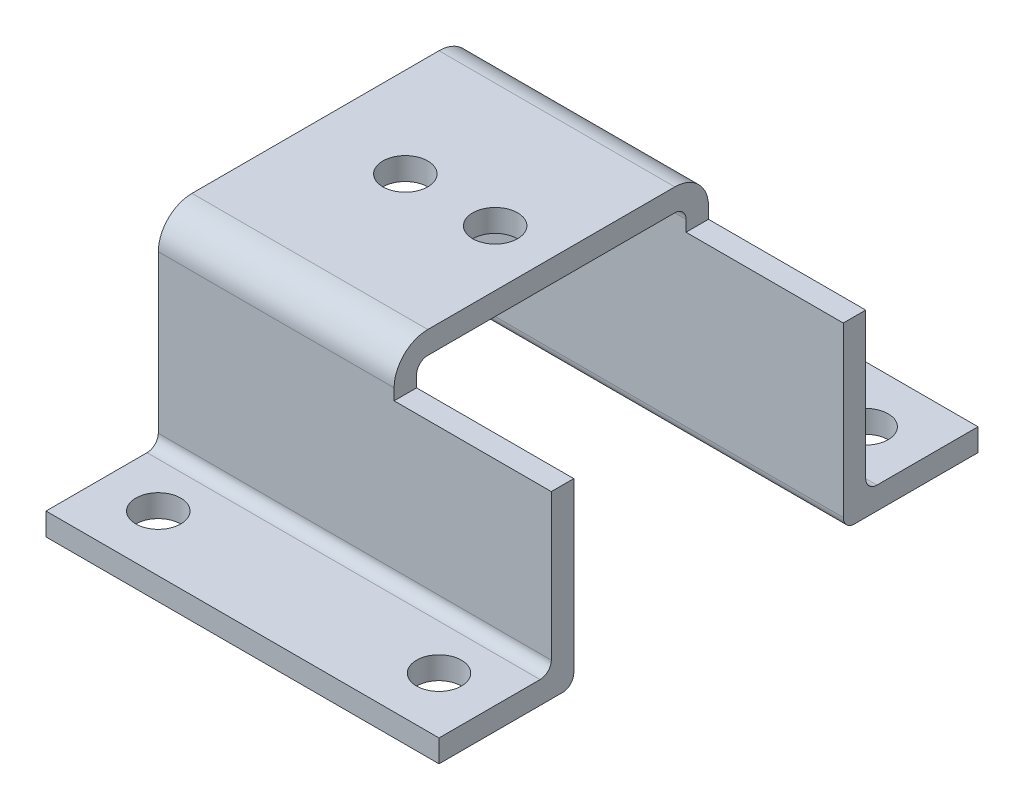
ISO-10303-21;
HEADER;
FILE_DESCRIPTION(('STEP AP214'),'2;1');
FILE_NAME('part.step','',(''),(''),'','','');
FILE_SCHEMA(('AUTOMOTIVE_DESIGN { 1 0 10303 214 1 1 1 1 }'));
ENDSEC;
DATA;
#1=APPLICATION_CONTEXT('core data for automotive mechanical design processes');
#2=APPLICATION_PROTOCOL_DEFINITION('international standard','automotive_design',2000,#1);
#3=PRODUCT_CONTEXT('',#1,'mechanical');
#4=PRODUCT('Part','Part','',(#3));
#5=PRODUCT_RELATED_PRODUCT_CATEGORY('part','',(#4));
#6=PRODUCT_DEFINITION_FORMATION('','',#4);
#7=PRODUCT_DEFINITION_CONTEXT('part definition',#1,'design');
#8=PRODUCT_DEFINITION('design','',#6,#7);
#9=PRODUCT_DEFINITION_SHAPE('','',#8);
#10=(LENGTH_UNIT() NAMED_UNIT(*) SI_UNIT(.MILLI.,.METRE.));
#11=(NAMED_UNIT(*) PLANE_ANGLE_UNIT() SI_UNIT($,.RADIAN.));
#12=(NAMED_UNIT(*) SI_UNIT($,.STERADIAN.) SOLID_ANGLE_UNIT());
#13=UNCERTAINTY_MEASURE_WITH_UNIT(LENGTH_MEASURE(1.E-05),#10,'distance_accuracy_value','');
#14=(GEOMETRIC_REPRESENTATION_CONTEXT(3) GLOBAL_UNCERTAINTY_ASSIGNED_CONTEXT((#13)) GLOBAL_UNIT_ASSIGNED_CONTEXT((#10,
#11,#12)) REPRESENTATION_CONTEXT('',''));
#15=CARTESIAN_POINT('',(0.,0.,0.));
#16=DIRECTION('',(0.,0.,1.));
#17=DIRECTION('',(1.,0.,0.));
#18=AXIS2_PLACEMENT_3D('',#15,#16,#17);
#19=CARTESIAN_POINT('',(17.5,20.,-13.));
#20=DIRECTION('',(0.,-1.,0.));
#21=DIRECTION('',(0.,0.,-1.));
#22=AXIS2_PLACEMENT_3D('',#19,#20,#21);
#23=PLANE('',#22);
#24=CARTESIAN_POINT('',(-9.5,20.,-24.));
#25=DIRECTION('',(0.,1.,0.));
#26=DIRECTION('',(0.,0.,1.));
#27=AXIS2_PLACEMENT_3D('',#24,#25,#26);
#28=CIRCLE('',#27,2.);
#29=CARTESIAN_POINT('',(-9.5,20.,-22.));
#30=VERTEX_POINT('',#29);
#31=EDGE_CURVE('E781',#30,#30,#28,.T.);
#32=ORIENTED_EDGE('',*,*,#31,.F.);
#33=EDGE_LOOP('',(#32));
#34=FACE_BOUND('',#33,.T.);
#35=CARTESIAN_POINT('',(-1.5,20.,-24.));
#36=DIRECTION('',(0.,1.,0.));
#37=DIRECTION('',(0.,0.,1.));
#38=AXIS2_PLACEMENT_3D('',#35,#36,#37);
#39=CIRCLE('',#38,2.);
#40=CARTESIAN_POINT('',(-1.5,20.,-22.));
#41=VERTEX_POINT('',#40);
#42=EDGE_CURVE('E783',#41,#41,#39,.T.);
#43=ORIENTED_EDGE('',*,*,#42,.F.);
#44=EDGE_LOOP('',(#43));
#45=FACE_BOUND('',#44,.T.);
#46=DIRECTION('',(0.,0.,1.));
#47=VECTOR('',#46,1.);
#48=CARTESIAN_POINT('',(3.5,20.,-13.));
#49=LINE('',#48,#47);
#50=CARTESIAN_POINT('',(3.5,20.,-35.));
#51=VERTEX_POINT('',#50);
#52=CARTESIAN_POINT('',(3.5,20.,-13.));
#53=VERTEX_POINT('',#52);
#54=EDGE_CURVE('E354',#51,#53,#49,.T.);
#55=ORIENTED_EDGE('',*,*,#54,.F.);
#56=DIRECTION('',(-1.,0.,0.));
#57=VECTOR('',#56,1.);
#58=CARTESIAN_POINT('',(17.5,20.,-35.));
#59=LINE('',#58,#57);
#60=CARTESIAN_POINT('',(-17.5,20.,-35.));
#61=VERTEX_POINT('',#60);
#62=EDGE_CURVE('E256',#51,#61,#59,.T.);
#63=ORIENTED_EDGE('',*,*,#62,.T.);
#64=DIRECTION('',(0.,0.,1.));
#65=VECTOR('',#64,1.);
#66=CARTESIAN_POINT('',(-17.5,20.,-13.));
#67=LINE('',#66,#65);
#68=CARTESIAN_POINT('',(-17.5,20.,-13.));
#69=VERTEX_POINT('',#68);
#70=EDGE_CURVE('E240',#61,#69,#67,.T.);
#71=ORIENTED_EDGE('',*,*,#70,.T.);
#72=DIRECTION('',(-1.,0.,0.));
#73=VECTOR('',#72,1.);
#74=CARTESIAN_POINT('',(17.5,20.,-13.));
#75=LINE('',#74,#73);
#76=EDGE_CURVE('E254',#53,#69,#75,.T.);
#77=ORIENTED_EDGE('',*,*,#76,.F.);
#78=EDGE_LOOP('',(#55,#63,#71,#77));
#79=FACE_BOUND('',#78,.T.);
#80=ADVANCED_FACE('F41',(#34,#45,#79),#23,.F.);
#81=CARTESIAN_POINT('',(17.5,1.00000000000001,-12.));
#82=DIRECTION('',(0.,0.,1.));
#83=DIRECTION('',(1.,0.,0.));
#84=AXIS2_PLACEMENT_3D('',#81,#82,#83);
#85=PLANE('',#84);
#86=DIRECTION('',(-1.,0.,0.));
#87=VECTOR('',#86,1.);
#88=CARTESIAN_POINT('',(17.5,16.,-12.));
#89=LINE('',#88,#87);
#90=CARTESIAN_POINT('',(17.5,16.,-12.));
#91=VERTEX_POINT('',#90);
#92=CARTESIAN_POINT('',(3.5,16.,-12.));
#93=VERTEX_POINT('',#92);
#94=EDGE_CURVE('E206',#91,#93,#89,.T.);
#95=ORIENTED_EDGE('',*,*,#94,.F.);
#96=DIRECTION('',(0.,1.,0.));
#97=VECTOR('',#96,1.);
#98=CARTESIAN_POINT('',(17.5,1.00000000000001,-12.));
#99=LINE('',#98,#97);
#100=CARTESIAN_POINT('',(17.5,1.00000000000001,-12.));
#101=VERTEX_POINT('',#100);
#102=EDGE_CURVE('E367',#101,#91,#99,.T.);
#103=ORIENTED_EDGE('',*,*,#102,.F.);
#104=DIRECTION('',(-1.,0.,0.));
#105=VECTOR('',#104,1.);
#106=CARTESIAN_POINT('',(17.5,1.00000000000001,-12.));
#107=LINE('',#106,#105);
#108=CARTESIAN_POINT('',(-17.5,1.00000000000001,-12.));
#109=VERTEX_POINT('',#108);
#110=EDGE_CURVE('E286',#101,#109,#107,.T.);
#111=ORIENTED_EDGE('',*,*,#110,.T.);
#112=DIRECTION('',(0.,1.,0.));
#113=VECTOR('',#112,1.);
#114=CARTESIAN_POINT('',(-17.5,1.00000000000001,-12.));
#115=LINE('',#114,#113);
#116=CARTESIAN_POINT('',(-17.5,17.,-12.));
#117=VERTEX_POINT('',#116);
#118=EDGE_CURVE('E210',#109,#117,#115,.T.);
#119=ORIENTED_EDGE('',*,*,#118,.T.);
#120=DIRECTION('',(-1.,0.,0.));
#121=VECTOR('',#120,1.);
#122=CARTESIAN_POINT('',(17.5,17.,-12.));
#123=LINE('',#122,#121);
#124=CARTESIAN_POINT('',(3.5,17.,-12.));
#125=VERTEX_POINT('',#124);
#126=EDGE_CURVE('E284',#125,#117,#123,.T.);
#127=ORIENTED_EDGE('',*,*,#126,.F.);
#128=DIRECTION('',(0.,1.,0.));
#129=VECTOR('',#128,1.);
#130=CARTESIAN_POINT('',(3.5,1.00000000000001,-12.));
#131=LINE('',#130,#129);
#132=EDGE_CURVE('E300',#93,#125,#131,.T.);
#133=ORIENTED_EDGE('',*,*,#132,.F.);
#134=EDGE_LOOP('',(#95,#103,#111,#119,#127,#133));
#135=FACE_BOUND('',#134,.T.);
#136=ADVANCED_FACE('F434',(#135),#85,.F.);
#137=CARTESIAN_POINT('',(17.5,17.,-36.));
#138=DIRECTION('',(0.,0.,-1.));
#139=DIRECTION('',(0.,1.,0.));
#140=AXIS2_PLACEMENT_3D('',#137,#138,#139);
#141=PLANE('',#140);
#142=DIRECTION('',(1.,0.,0.));
#143=VECTOR('',#142,1.);
#144=CARTESIAN_POINT('',(17.5,16.,-36.));
#145=LINE('',#144,#143);
#146=CARTESIAN_POINT('',(3.5,16.,-36.));
#147=VERTEX_POINT('',#146);
#148=CARTESIAN_POINT('',(17.5,16.,-36.));
#149=VERTEX_POINT('',#148);
#150=EDGE_CURVE('E340',#147,#149,#145,.T.);
#151=ORIENTED_EDGE('',*,*,#150,.F.);
#152=DIRECTION('',(0.,-1.,0.));
#153=VECTOR('',#152,1.);
#154=CARTESIAN_POINT('',(3.5,17.,-36.));
#155=LINE('',#154,#153);
#156=CARTESIAN_POINT('',(3.5,17.,-36.));
#157=VERTEX_POINT('',#156);
#158=EDGE_CURVE('E349',#157,#147,#155,.T.);
#159=ORIENTED_EDGE('',*,*,#158,.F.);
#160=DIRECTION('',(-1.,0.,0.));
#161=VECTOR('',#160,1.);
#162=CARTESIAN_POINT('',(17.5,17.,-36.));
#163=LINE('',#162,#161);
#164=CARTESIAN_POINT('',(-17.5,17.,-36.));
#165=VERTEX_POINT('',#164);
#166=EDGE_CURVE('E278',#157,#165,#163,.T.);
#167=ORIENTED_EDGE('',*,*,#166,.T.);
#168=DIRECTION('',(0.,-1.,0.));
#169=VECTOR('',#168,1.);
#170=CARTESIAN_POINT('',(-17.5,17.,-36.));
#171=LINE('',#170,#169);
#172=CARTESIAN_POINT('',(-17.5,1.00000000000001,-36.));
#173=VERTEX_POINT('',#172);
#174=EDGE_CURVE('E222',#165,#173,#171,.T.);
#175=ORIENTED_EDGE('',*,*,#174,.T.);
#176=DIRECTION('',(-1.,0.,0.));
#177=VECTOR('',#176,1.);
#178=CARTESIAN_POINT('',(17.5,1.00000000000001,-36.));
#179=LINE('',#178,#177);
#180=CARTESIAN_POINT('',(17.5,1.00000000000001,-36.));
#181=VERTEX_POINT('',#180);
#182=EDGE_CURVE('E275',#181,#173,#179,.T.);
#183=ORIENTED_EDGE('',*,*,#182,.F.);
#184=DIRECTION('',(0.,-1.,0.));
#185=VECTOR('',#184,1.);
#186=CARTESIAN_POINT('',(17.5,17.,-36.));
#187=LINE('',#186,#185);
#188=EDGE_CURVE('E369',#149,#181,#187,.T.);
#189=ORIENTED_EDGE('',*,*,#188,.F.);
#190=EDGE_LOOP('',(#151,#159,#167,#175,#183,#189));
#191=FACE_BOUND('',#190,.T.);
#192=ADVANCED_FACE('F462',(#191),#141,.F.);
#193=CARTESIAN_POINT('',(17.5,17.,-35.));
#194=DIRECTION('',(-1.,0.,0.));
#195=DIRECTION('',(0.,0.,1.));
#196=AXIS2_PLACEMENT_3D('',#193,#194,#195);
#197=CYLINDRICAL_SURFACE('',#196,3.);
#198=CARTESIAN_POINT('',(3.5,17.,-35.));
#199=DIRECTION('',(1.,0.,0.));
#200=DIRECTION('',(0.,0.,-1.));
#201=AXIS2_PLACEMENT_3D('',#198,#199,#200);
#202=CIRCLE('',#201,3.);
#203=CARTESIAN_POINT('',(3.5,17.,-38.));
#204=VERTEX_POINT('',#203);
#205=EDGE_CURVE('E351',#204,#51,#202,.T.);
#206=ORIENTED_EDGE('',*,*,#205,.F.);
#207=DIRECTION('',(-1.,0.,0.));
#208=VECTOR('',#207,1.);
#209=CARTESIAN_POINT('',(17.5,17.,-38.));
#210=LINE('',#209,#208);
#211=CARTESIAN_POINT('',(-17.5,17.,-38.));
#212=VERTEX_POINT('',#211);
#213=EDGE_CURVE('E258',#204,#212,#210,.T.);
#214=ORIENTED_EDGE('',*,*,#213,.T.);
#215=CARTESIAN_POINT('',(-17.5,17.,-35.));
#216=DIRECTION('',(1.,0.,0.));
#217=DIRECTION('',(0.,0.,-1.));
#218=AXIS2_PLACEMENT_3D('',#215,#216,#217);
#219=CIRCLE('',#218,3.);
#220=EDGE_CURVE('E237',#212,#61,#219,.T.);
#221=ORIENTED_EDGE('',*,*,#220,.T.);
#222=ORIENTED_EDGE('',*,*,#62,.F.);
#223=EDGE_LOOP('',(#206,#214,#221,#222));
#224=FACE_BOUND('',#223,.T.);
#225=ADVANCED_FACE('F491',(#224),#197,.T.);
#226=CARTESIAN_POINT('',(17.5,17.,-13.));
#227=DIRECTION('',(-1.,0.,0.));
#228=DIRECTION('',(0.,0.,1.));
#229=AXIS2_PLACEMENT_3D('',#226,#227,#228);
#230=CYLINDRICAL_SURFACE('',#229,3.);
#231=CARTESIAN_POINT('',(3.5,17.,-13.));
#232=DIRECTION('',(1.,0.,0.));
#233=DIRECTION('',(0.,0.,-1.));
#234=AXIS2_PLACEMENT_3D('',#231,#232,#233);
#235=CIRCLE('',#234,3.);
#236=CARTESIAN_POINT('',(3.5,17.,-10.));
#237=VERTEX_POINT('',#236);
#238=EDGE_CURVE('E335',#53,#237,#235,.T.);
#239=ORIENTED_EDGE('',*,*,#238,.F.);
#240=ORIENTED_EDGE('',*,*,#76,.T.);
#241=CARTESIAN_POINT('',(-17.5,17.,-13.));
#242=DIRECTION('',(1.,0.,0.));
#243=DIRECTION('',(0.,0.,-1.));
#244=AXIS2_PLACEMENT_3D('',#241,#242,#243);
#245=CIRCLE('',#244,3.);
#246=CARTESIAN_POINT('',(-17.5,17.,-10.));
#247=VERTEX_POINT('',#246);
#248=EDGE_CURVE('E243',#69,#247,#245,.T.);
#249=ORIENTED_EDGE('',*,*,#248,.T.);
#250=DIRECTION('',(-1.,0.,0.));
#251=VECTOR('',#250,1.);
#252=CARTESIAN_POINT('',(17.5,17.,-10.));
#253=LINE('',#252,#251);
#254=EDGE_CURVE('E193',#237,#247,#253,.T.);
#255=ORIENTED_EDGE('',*,*,#254,.F.);
#256=EDGE_LOOP('',(#239,#240,#249,#255));
#257=FACE_BOUND('',#256,.T.);
#258=ADVANCED_FACE('F499',(#257),#230,.T.);
#259=CARTESIAN_POINT('',(17.5,1.,-11.));
#260=DIRECTION('',(-1.,0.,0.));
#261=DIRECTION('',(0.,0.,1.));
#262=AXIS2_PLACEMENT_3D('',#259,#260,#261);
#263=PLANE('',#262);
#264=DIRECTION('',(0.,1.,0.));
#265=VECTOR('',#264,1.);
#266=CARTESIAN_POINT('',(17.5,17.,-38.));
#267=LINE('',#266,#265);
#268=CARTESIAN_POINT('',(17.5,3.00000000000001,-38.));
#269=VERTEX_POINT('',#268);
#270=CARTESIAN_POINT('',(17.5,16.,-38.));
#271=VERTEX_POINT('',#270);
#272=EDGE_CURVE('E184',#269,#271,#267,.T.);
#273=ORIENTED_EDGE('',*,*,#272,.T.);
#274=DIRECTION('',(0.,0.,1.));
#275=VECTOR('',#274,1.);
#276=CARTESIAN_POINT('',(17.5,16.,-10.));
#277=LINE('',#276,#275);
#278=EDGE_CURVE('E52',#271,#149,#277,.T.);
#279=ORIENTED_EDGE('',*,*,#278,.T.);
#280=ORIENTED_EDGE('',*,*,#188,.T.);
#281=CARTESIAN_POINT('',(17.5,1.,-37.));
#282=DIRECTION('',(1.,0.,0.));
#283=DIRECTION('',(0.,0.,1.));
#284=AXIS2_PLACEMENT_3D('',#281,#282,#283);
#285=CIRCLE('',#284,1.);
#286=CARTESIAN_POINT('',(17.5,0.,-37.));
#287=VERTEX_POINT('',#286);
#288=EDGE_CURVE('E371',#181,#287,#285,.T.);
#289=ORIENTED_EDGE('',*,*,#288,.T.);
#290=DIRECTION('',(0.,0.,-1.));
#291=VECTOR('',#290,1.);
#292=CARTESIAN_POINT('',(17.5,0.,-37.));
#293=LINE('',#292,#291);
#294=CARTESIAN_POINT('',(17.5,0.,-48.));
#295=VERTEX_POINT('',#294);
#296=EDGE_CURVE('E373',#287,#295,#293,.T.);
#297=ORIENTED_EDGE('',*,*,#296,.T.);
#298=DIRECTION('',(0.,1.,0.));
#299=VECTOR('',#298,1.);
#300=CARTESIAN_POINT('',(17.5,2.,-48.));
#301=LINE('',#300,#299);
#302=CARTESIAN_POINT('',(17.5,2.,-48.));
#303=VERTEX_POINT('',#302);
#304=EDGE_CURVE('E375',#295,#303,#301,.T.);
#305=ORIENTED_EDGE('',*,*,#304,.T.);
#306=DIRECTION('',(0.,0.,1.));
#307=VECTOR('',#306,1.);
#308=CARTESIAN_POINT('',(17.5,2.,-39.));
#309=LINE('',#308,#307);
#310=CARTESIAN_POINT('',(17.5,2.,-39.));
#311=VERTEX_POINT('',#310);
#312=EDGE_CURVE('E377',#303,#311,#309,.T.);
#313=ORIENTED_EDGE('',*,*,#312,.T.);
#314=CARTESIAN_POINT('',(17.5,3.,-39.));
#315=DIRECTION('',(-1.,0.,0.));
#316=DIRECTION('',(0.,0.,-1.));
#317=AXIS2_PLACEMENT_3D('',#314,#315,#316);
#318=CIRCLE('',#317,1.);
#319=EDGE_CURVE('E379',#311,#269,#318,.T.);
#320=ORIENTED_EDGE('',*,*,#319,.T.);
#321=EDGE_LOOP('',(#273,#279,#280,#289,#297,#305,#313,#320));
#322=FACE_BOUND('',#321,.T.);
#323=ADVANCED_FACE('F384',(#322),#263,.F.);
#324=CARTESIAN_POINT('',(17.5,2.,0.));
#325=DIRECTION('',(0.,0.,-1.));
#326=DIRECTION('',(-1.,0.,0.));
#327=AXIS2_PLACEMENT_3D('',#324,#325,#326);
#328=PLANE('',#327);
#329=DIRECTION('',(0.,-1.,0.));
#330=VECTOR('',#329,1.);
#331=CARTESIAN_POINT('',(-17.5,2.,0.));
#332=LINE('',#331,#330);
#333=CARTESIAN_POINT('',(-17.5,2.,0.));
#334=VERTEX_POINT('',#333);
#335=CARTESIAN_POINT('',(-17.5,0.,0.));
#336=VERTEX_POINT('',#335);
#337=EDGE_CURVE('E202',#334,#336,#332,.T.);
#338=ORIENTED_EDGE('',*,*,#337,.T.);
#339=DIRECTION('',(-1.,0.,0.));
#340=VECTOR('',#339,1.);
#341=CARTESIAN_POINT('',(17.5,0.,0.));
#342=LINE('',#341,#340);
#343=CARTESIAN_POINT('',(17.5,0.,0.));
#344=VERTEX_POINT('',#343);
#345=EDGE_CURVE('E50',#344,#336,#342,.T.);
#346=ORIENTED_EDGE('',*,*,#345,.F.);
#347=DIRECTION('',(0.,-1.,0.));
#348=VECTOR('',#347,1.);
#349=CARTESIAN_POINT('',(17.5,2.,0.));
#350=LINE('',#349,#348);
#351=CARTESIAN_POINT('',(17.5,2.,0.));
#352=VERTEX_POINT('',#351);
#353=EDGE_CURVE('E250',#352,#344,#350,.T.);
#354=ORIENTED_EDGE('',*,*,#353,.F.);
#355=DIRECTION('',(-1.,0.,0.));
#356=VECTOR('',#355,1.);
#357=CARTESIAN_POINT('',(17.5,2.,0.));
#358=LINE('',#357,#356);
#359=EDGE_CURVE('E198',#352,#334,#358,.T.);
#360=ORIENTED_EDGE('',*,*,#359,.T.);
#361=EDGE_LOOP('',(#338,#346,#354,#360));
#362=FACE_BOUND('',#361,.T.);
#363=ADVANCED_FACE('F43',(#362),#328,.F.);
#364=CARTESIAN_POINT('',(17.5,0.,0.));
#365=DIRECTION('',(0.,1.,0.));
#366=DIRECTION('',(0.,0.,1.));
#367=AXIS2_PLACEMENT_3D('',#364,#365,#366);
#368=PLANE('',#367);
#369=CARTESIAN_POINT('',(12.5,0.,-5.));
#370=DIRECTION('',(0.,1.,0.));
#371=DIRECTION('',(0.,0.,1.));
#372=AXIS2_PLACEMENT_3D('',#369,#370,#371);
#373=CIRCLE('',#372,2.);
#374=CARTESIAN_POINT('',(12.5,0.,-3.));
#375=VERTEX_POINT('',#374);
#376=EDGE_CURVE('E782',#375,#375,#373,.T.);
#377=ORIENTED_EDGE('',*,*,#376,.T.);
#378=EDGE_LOOP('',(#377));
#379=FACE_BOUND('',#378,.T.);
#380=CARTESIAN_POINT('',(-12.5,0.,-5.));
#381=DIRECTION('',(0.,1.,0.));
#382=DIRECTION('',(0.,0.,1.));
#383=AXIS2_PLACEMENT_3D('',#380,#381,#382);
#384=CIRCLE('',#383,2.);
#385=CARTESIAN_POINT('',(-12.5,0.,-3.));
#386=VERTEX_POINT('',#385);
#387=EDGE_CURVE('E305',#386,#386,#384,.T.);
#388=ORIENTED_EDGE('',*,*,#387,.T.);
#389=EDGE_LOOP('',(#388));
#390=FACE_BOUND('',#389,.T.);
#391=DIRECTION('',(0.,0.,-1.));
#392=VECTOR('',#391,1.);
#393=CARTESIAN_POINT('',(-17.5,0.,0.));
#394=LINE('',#393,#392);
#395=CARTESIAN_POINT('',(-17.5,0.,-11.));
#396=VERTEX_POINT('',#395);
#397=EDGE_CURVE('E205',#336,#396,#394,.T.);
#398=ORIENTED_EDGE('',*,*,#397,.T.);
#399=DIRECTION('',(-1.,0.,0.));
#400=VECTOR('',#399,1.);
#401=CARTESIAN_POINT('',(17.5,0.,-11.));
#402=LINE('',#401,#400);
#403=CARTESIAN_POINT('',(17.5,0.,-11.));
#404=VERTEX_POINT('',#403);
#405=EDGE_CURVE('E289',#404,#396,#402,.T.);
#406=ORIENTED_EDGE('',*,*,#405,.F.);
#407=DIRECTION('',(0.,0.,-1.));
#408=VECTOR('',#407,1.);
#409=CARTESIAN_POINT('',(17.5,0.,0.));
#410=LINE('',#409,#408);
#411=EDGE_CURVE('E146',#344,#404,#410,.T.);
#412=ORIENTED_EDGE('',*,*,#411,.F.);
#413=ORIENTED_EDGE('',*,*,#345,.T.);
#414=EDGE_LOOP('',(#398,#406,#412,#413));
#415=FACE_BOUND('',#414,.T.);
#416=ADVANCED_FACE('F505',(#379,#390,#415),#368,.F.);
#417=CARTESIAN_POINT('',(17.5,1.,-11.));
#418=DIRECTION('',(-1.,0.,0.));
#419=DIRECTION('',(0.,0.,1.));
#420=AXIS2_PLACEMENT_3D('',#417,#418,#419);
#421=CYLINDRICAL_SURFACE('',#420,1.);
#422=CARTESIAN_POINT('',(-17.5,1.,-11.));
#423=DIRECTION('',(1.,0.,0.));
#424=DIRECTION('',(0.,0.,1.));
#425=AXIS2_PLACEMENT_3D('',#422,#423,#424);
#426=CIRCLE('',#425,1.);
#427=EDGE_CURVE('E208',#396,#109,#426,.T.);
#428=ORIENTED_EDGE('',*,*,#427,.T.);
#429=ORIENTED_EDGE('',*,*,#110,.F.);
#430=CARTESIAN_POINT('',(17.5,1.,-11.));
#431=DIRECTION('',(1.,0.,0.));
#432=DIRECTION('',(0.,0.,1.));
#433=AXIS2_PLACEMENT_3D('',#430,#431,#432);
#434=CIRCLE('',#433,1.);
#435=EDGE_CURVE('E365',#404,#101,#434,.T.);
#436=ORIENTED_EDGE('',*,*,#435,.F.);
#437=ORIENTED_EDGE('',*,*,#405,.T.);
#438=EDGE_LOOP('',(#428,#429,#436,#437));
#439=FACE_BOUND('',#438,.T.);
#440=ADVANCED_FACE('F439',(#439),#421,.T.);
#441=CARTESIAN_POINT('',(17.5,17.,-13.));
#442=DIRECTION('',(-1.,0.,0.));
#443=DIRECTION('',(0.,0.,1.));
#444=AXIS2_PLACEMENT_3D('',#441,#442,#443);
#445=CYLINDRICAL_SURFACE('',#444,1.);
#446=DIRECTION('',(-1.,0.,0.));
#447=VECTOR('',#446,1.);
#448=CARTESIAN_POINT('',(17.5,18.,-13.));
#449=LINE('',#448,#447);
#450=CARTESIAN_POINT('',(3.5,18.,-13.));
#451=VERTEX_POINT('',#450);
#452=CARTESIAN_POINT('',(-17.5,18.,-13.));
#453=VERTEX_POINT('',#452);
#454=EDGE_CURVE('E282',#451,#453,#449,.T.);
#455=ORIENTED_EDGE('',*,*,#454,.F.);
#456=CARTESIAN_POINT('',(3.5,17.,-13.));
#457=DIRECTION('',(-1.,0.,0.));
#458=DIRECTION('',(0.,0.,-1.));
#459=AXIS2_PLACEMENT_3D('',#456,#457,#458);
#460=CIRCLE('',#459,1.);
#461=EDGE_CURVE('E343',#125,#451,#460,.T.);
#462=ORIENTED_EDGE('',*,*,#461,.F.);
#463=ORIENTED_EDGE('',*,*,#126,.T.);
#464=CARTESIAN_POINT('',(-17.5,17.,-13.));
#465=DIRECTION('',(-1.,0.,0.));
#466=DIRECTION('',(0.,0.,-1.));
#467=AXIS2_PLACEMENT_3D('',#464,#465,#466);
#468=CIRCLE('',#467,1.);
#469=EDGE_CURVE('E213',#117,#453,#468,.T.);
#470=ORIENTED_EDGE('',*,*,#469,.T.);
#471=EDGE_LOOP('',(#455,#462,#463,#470));
#472=FACE_BOUND('',#471,.T.);
#473=ADVANCED_FACE('F450',(#472),#445,.F.);
#474=CARTESIAN_POINT('',(17.5,18.,-13.));
#475=DIRECTION('',(0.,1.,0.));
#476=DIRECTION('',(0.,0.,1.));
#477=AXIS2_PLACEMENT_3D('',#474,#475,#476);
#478=PLANE('',#477);
#479=CARTESIAN_POINT('',(-9.5,18.,-24.));
#480=DIRECTION('',(0.,1.,0.));
#481=DIRECTION('',(0.,0.,1.));
#482=AXIS2_PLACEMENT_3D('',#479,#480,#481);
#483=CIRCLE('',#482,2.);
#484=CARTESIAN_POINT('',(-9.5,18.,-22.));
#485=VERTEX_POINT('',#484);
#486=EDGE_CURVE('E45',#485,#485,#483,.F.);
#487=ORIENTED_EDGE('',*,*,#486,.F.);
#488=EDGE_LOOP('',(#487));
#489=FACE_BOUND('',#488,.T.);
#490=CARTESIAN_POINT('',(-1.5,18.,-24.));
#491=DIRECTION('',(0.,1.,0.));
#492=DIRECTION('',(0.,0.,1.));
#493=AXIS2_PLACEMENT_3D('',#490,#491,#492);
#494=CIRCLE('',#493,2.);
#495=CARTESIAN_POINT('',(-1.5,18.,-22.));
#496=VERTEX_POINT('',#495);
#497=EDGE_CURVE('E307',#496,#496,#494,.F.);
#498=ORIENTED_EDGE('',*,*,#497,.F.);
#499=EDGE_LOOP('',(#498));
#500=FACE_BOUND('',#499,.T.);
#501=DIRECTION('',(-1.,0.,0.));
#502=VECTOR('',#501,1.);
#503=CARTESIAN_POINT('',(17.5,18.,-35.));
#504=LINE('',#503,#502);
#505=CARTESIAN_POINT('',(3.5,18.,-35.));
#506=VERTEX_POINT('',#505);
#507=CARTESIAN_POINT('',(-17.5,18.,-35.));
#508=VERTEX_POINT('',#507);
#509=EDGE_CURVE('E280',#506,#508,#504,.T.);
#510=ORIENTED_EDGE('',*,*,#509,.F.);
#511=DIRECTION('',(0.,0.,-1.));
#512=VECTOR('',#511,1.);
#513=CARTESIAN_POINT('',(3.5,18.,-13.));
#514=LINE('',#513,#512);
#515=EDGE_CURVE('E346',#451,#506,#514,.T.);
#516=ORIENTED_EDGE('',*,*,#515,.F.);
#517=ORIENTED_EDGE('',*,*,#454,.T.);
#518=DIRECTION('',(0.,0.,-1.));
#519=VECTOR('',#518,1.);
#520=CARTESIAN_POINT('',(-17.5,18.,-13.));
#521=LINE('',#520,#519);
#522=EDGE_CURVE('E216',#453,#508,#521,.T.);
#523=ORIENTED_EDGE('',*,*,#522,.T.);
#524=EDGE_LOOP('',(#510,#516,#517,#523));
#525=FACE_BOUND('',#524,.T.);
#526=ADVANCED_FACE('F456',(#489,#500,#525),#478,.F.);
#527=CARTESIAN_POINT('',(17.5,17.,-35.));
#528=DIRECTION('',(-1.,0.,0.));
#529=DIRECTION('',(0.,0.,1.));
#530=AXIS2_PLACEMENT_3D('',#527,#528,#529);
#531=CYLINDRICAL_SURFACE('',#530,1.);
#532=ORIENTED_EDGE('',*,*,#166,.F.);
#533=CARTESIAN_POINT('',(3.5,17.,-35.));
#534=DIRECTION('',(-1.,0.,0.));
#535=DIRECTION('',(0.,0.,-1.));
#536=AXIS2_PLACEMENT_3D('',#533,#534,#535);
#537=CIRCLE('',#536,1.);
#538=EDGE_CURVE('E59',#506,#157,#537,.T.);
#539=ORIENTED_EDGE('',*,*,#538,.F.);
#540=ORIENTED_EDGE('',*,*,#509,.T.);
#541=CARTESIAN_POINT('',(-17.5,17.,-35.));
#542=DIRECTION('',(-1.,0.,0.));
#543=DIRECTION('',(0.,0.,-1.));
#544=AXIS2_PLACEMENT_3D('',#541,#542,#543);
#545=CIRCLE('',#544,1.);
#546=EDGE_CURVE('E219',#508,#165,#545,.T.);
#547=ORIENTED_EDGE('',*,*,#546,.T.);
#548=EDGE_LOOP('',(#532,#539,#540,#547));
#549=FACE_BOUND('',#548,.T.);
#550=ADVANCED_FACE('F459',(#549),#531,.F.);
#551=CARTESIAN_POINT('',(17.5,1.,-37.));
#552=DIRECTION('',(-1.,0.,0.));
#553=DIRECTION('',(0.,0.,1.));
#554=AXIS2_PLACEMENT_3D('',#551,#552,#553);
#555=CYLINDRICAL_SURFACE('',#554,1.);
#556=CARTESIAN_POINT('',(-17.5,1.,-37.));
#557=DIRECTION('',(1.,0.,0.));
#558=DIRECTION('',(0.,0.,1.));
#559=AXIS2_PLACEMENT_3D('',#556,#557,#558);
#560=CIRCLE('',#559,1.);
#561=CARTESIAN_POINT('',(-17.5,0.,-37.));
#562=VERTEX_POINT('',#561);
#563=EDGE_CURVE('E224',#173,#562,#560,.T.);
#564=ORIENTED_EDGE('',*,*,#563,.T.);
#565=DIRECTION('',(-1.,0.,0.));
#566=VECTOR('',#565,1.);
#567=CARTESIAN_POINT('',(17.5,0.,-37.));
#568=LINE('',#567,#566);
#569=EDGE_CURVE('E272',#287,#562,#568,.T.);
#570=ORIENTED_EDGE('',*,*,#569,.F.);
#571=ORIENTED_EDGE('',*,*,#288,.F.);
#572=ORIENTED_EDGE('',*,*,#182,.T.);
#573=EDGE_LOOP('',(#564,#570,#571,#572));
#574=FACE_BOUND('',#573,.T.);
#575=ADVANCED_FACE('F469',(#574),#555,.T.);
#576=CARTESIAN_POINT('',(17.5,0.,-37.));
#577=DIRECTION('',(0.,1.,0.));
#578=DIRECTION('',(0.,0.,1.));
#579=AXIS2_PLACEMENT_3D('',#576,#577,#578);
#580=PLANE('',#579);
#581=CARTESIAN_POINT('',(-12.5,0.,-43.));
#582=DIRECTION('',(0.,1.,0.));
#583=DIRECTION('',(0.,0.,1.));
#584=AXIS2_PLACEMENT_3D('',#581,#582,#583);
#585=CIRCLE('',#584,2.);
#586=CARTESIAN_POINT('',(-12.5,0.,-41.));
#587=VERTEX_POINT('',#586);
#588=EDGE_CURVE('E297',#587,#587,#585,.T.);
#589=ORIENTED_EDGE('',*,*,#588,.T.);
#590=EDGE_LOOP('',(#589));
#591=FACE_BOUND('',#590,.T.);
#592=CARTESIAN_POINT('',(12.5,0.,-43.));
#593=DIRECTION('',(0.,1.,0.));
#594=DIRECTION('',(0.,0.,1.));
#595=AXIS2_PLACEMENT_3D('',#592,#593,#594);
#596=CIRCLE('',#595,2.);
#597=CARTESIAN_POINT('',(12.5,0.,-41.));
#598=VERTEX_POINT('',#597);
#599=EDGE_CURVE('E312',#598,#598,#596,.T.);
#600=ORIENTED_EDGE('',*,*,#599,.T.);
#601=EDGE_LOOP('',(#600));
#602=FACE_BOUND('',#601,.T.);
#603=DIRECTION('',(0.,0.,-1.));
#604=VECTOR('',#603,1.);
#605=CARTESIAN_POINT('',(-17.5,0.,-37.));
#606=LINE('',#605,#604);
#607=CARTESIAN_POINT('',(-17.5,0.,-48.));
#608=VERTEX_POINT('',#607);
#609=EDGE_CURVE('E226',#562,#608,#606,.T.);
#610=ORIENTED_EDGE('',*,*,#609,.T.);
#611=DIRECTION('',(-1.,0.,0.));
#612=VECTOR('',#611,1.);
#613=CARTESIAN_POINT('',(17.5,0.,-48.));
#614=LINE('',#613,#612);
#615=EDGE_CURVE('E269',#295,#608,#614,.T.);
#616=ORIENTED_EDGE('',*,*,#615,.F.);
#617=ORIENTED_EDGE('',*,*,#296,.F.);
#618=ORIENTED_EDGE('',*,*,#569,.T.);
#619=EDGE_LOOP('',(#610,#616,#617,#618));
#620=FACE_BOUND('',#619,.T.);
#621=ADVANCED_FACE('F473',(#591,#602,#620),#580,.F.);
#622=CARTESIAN_POINT('',(17.5,2.,-48.));
#623=DIRECTION('',(0.,0.,1.));
#624=DIRECTION('',(1.,0.,0.));
#625=AXIS2_PLACEMENT_3D('',#622,#623,#624);
#626=PLANE('',#625);
#627=DIRECTION('',(0.,1.,0.));
#628=VECTOR('',#627,1.);
#629=CARTESIAN_POINT('',(-17.5,2.,-48.));
#630=LINE('',#629,#628);
#631=CARTESIAN_POINT('',(-17.5,2.,-48.));
#632=VERTEX_POINT('',#631);
#633=EDGE_CURVE('E228',#608,#632,#630,.T.);
#634=ORIENTED_EDGE('',*,*,#633,.T.);
#635=DIRECTION('',(-1.,0.,0.));
#636=VECTOR('',#635,1.);
#637=CARTESIAN_POINT('',(17.5,2.,-48.));
#638=LINE('',#637,#636);
#639=EDGE_CURVE('E266',#303,#632,#638,.T.);
#640=ORIENTED_EDGE('',*,*,#639,.F.);
#641=ORIENTED_EDGE('',*,*,#304,.F.);
#642=ORIENTED_EDGE('',*,*,#615,.T.);
#643=EDGE_LOOP('',(#634,#640,#641,#642));
#644=FACE_BOUND('',#643,.T.);
#645=ADVANCED_FACE('F478',(#644),#626,.F.);
#646=CARTESIAN_POINT('',(17.5,2.,-39.));
#647=DIRECTION('',(0.,-1.,0.));
#648=DIRECTION('',(0.,0.,-1.));
#649=AXIS2_PLACEMENT_3D('',#646,#647,#648);
#650=PLANE('',#649);
#651=CARTESIAN_POINT('',(-12.5,2.,-43.));
#652=DIRECTION('',(0.,-1.,0.));
#653=DIRECTION('',(0.,0.,-1.));
#654=AXIS2_PLACEMENT_3D('',#651,#652,#653);
#655=CIRCLE('',#654,2.);
#656=CARTESIAN_POINT('',(-12.5,2.,-45.));
#657=VERTEX_POINT('',#656);
#658=EDGE_CURVE('E296',#657,#657,#655,.T.);
#659=ORIENTED_EDGE('',*,*,#658,.T.);
#660=EDGE_LOOP('',(#659));
#661=FACE_BOUND('',#660,.T.);
#662=CARTESIAN_POINT('',(12.5,2.,-43.));
#663=DIRECTION('',(0.,-1.,0.));
#664=DIRECTION('',(0.,0.,-1.));
#665=AXIS2_PLACEMENT_3D('',#662,#663,#664);
#666=CIRCLE('',#665,2.);
#667=CARTESIAN_POINT('',(12.5,2.,-45.));
#668=VERTEX_POINT('',#667);
#669=EDGE_CURVE('E293',#668,#668,#666,.T.);
#670=ORIENTED_EDGE('',*,*,#669,.T.);
#671=EDGE_LOOP('',(#670));
#672=FACE_BOUND('',#671,.T.);
#673=DIRECTION('',(0.,0.,1.));
#674=VECTOR('',#673,1.);
#675=CARTESIAN_POINT('',(-17.5,2.,-39.));
#676=LINE('',#675,#674);
#677=CARTESIAN_POINT('',(-17.5,2.,-39.));
#678=VERTEX_POINT('',#677);
#679=EDGE_CURVE('E230',#632,#678,#676,.T.);
#680=ORIENTED_EDGE('',*,*,#679,.T.);
#681=DIRECTION('',(-1.,0.,0.));
#682=VECTOR('',#681,1.);
#683=CARTESIAN_POINT('',(17.5,2.,-39.));
#684=LINE('',#683,#682);
#685=EDGE_CURVE('E263',#311,#678,#684,.T.);
#686=ORIENTED_EDGE('',*,*,#685,.F.);
#687=ORIENTED_EDGE('',*,*,#312,.F.);
#688=ORIENTED_EDGE('',*,*,#639,.T.);
#689=EDGE_LOOP('',(#680,#686,#687,#688));
#690=FACE_BOUND('',#689,.T.);
#691=ADVANCED_FACE('F482',(#661,#672,#690),#650,.F.);
#692=CARTESIAN_POINT('',(17.5,3.,-39.));
#693=DIRECTION('',(-1.,0.,0.));
#694=DIRECTION('',(0.,0.,1.));
#695=AXIS2_PLACEMENT_3D('',#692,#693,#694);
#696=CYLINDRICAL_SURFACE('',#695,1.);
#697=CARTESIAN_POINT('',(-17.5,3.,-39.));
#698=DIRECTION('',(-1.,0.,0.));
#699=DIRECTION('',(0.,0.,-1.));
#700=AXIS2_PLACEMENT_3D('',#697,#698,#699);
#701=CIRCLE('',#700,1.);
#702=CARTESIAN_POINT('',(-17.5,3.00000000000001,-38.));
#703=VERTEX_POINT('',#702);
#704=EDGE_CURVE('E232',#678,#703,#701,.T.);
#705=ORIENTED_EDGE('',*,*,#704,.T.);
#706=DIRECTION('',(-1.,0.,0.));
#707=VECTOR('',#706,1.);
#708=CARTESIAN_POINT('',(17.5,3.00000000000001,-38.));
#709=LINE('',#708,#707);
#710=EDGE_CURVE('E260',#269,#703,#709,.T.);
#711=ORIENTED_EDGE('',*,*,#710,.F.);
#712=ORIENTED_EDGE('',*,*,#319,.F.);
#713=ORIENTED_EDGE('',*,*,#685,.T.);
#714=EDGE_LOOP('',(#705,#711,#712,#713));
#715=FACE_BOUND('',#714,.T.);
#716=ADVANCED_FACE('F486',(#715),#696,.F.);
#717=CARTESIAN_POINT('',(17.5,17.,-38.));
#718=DIRECTION('',(0.,0.,1.));
#719=DIRECTION('',(1.,0.,0.));
#720=AXIS2_PLACEMENT_3D('',#717,#718,#719);
#721=PLANE('',#720);
#722=ORIENTED_EDGE('',*,*,#213,.F.);
#723=DIRECTION('',(0.,-1.,0.));
#724=VECTOR('',#723,1.);
#725=CARTESIAN_POINT('',(3.5,16.,-38.));
#726=LINE('',#725,#724);
#727=CARTESIAN_POINT('',(3.5,16.,-38.));
#728=VERTEX_POINT('',#727);
#729=EDGE_CURVE('E323',#204,#728,#726,.T.);
#730=ORIENTED_EDGE('',*,*,#729,.T.);
#731=DIRECTION('',(-1.,0.,0.));
#732=VECTOR('',#731,1.);
#733=CARTESIAN_POINT('',(139.602169721074,16.,-38.));
#734=LINE('',#733,#732);
#735=EDGE_CURVE('E337',#271,#728,#734,.T.);
#736=ORIENTED_EDGE('',*,*,#735,.F.);
#737=ORIENTED_EDGE('',*,*,#272,.F.);
#738=ORIENTED_EDGE('',*,*,#710,.T.);
#739=DIRECTION('',(0.,1.,0.));
#740=VECTOR('',#739,1.);
#741=CARTESIAN_POINT('',(-17.5,17.,-38.));
#742=LINE('',#741,#740);
#743=EDGE_CURVE('E234',#703,#212,#742,.T.);
#744=ORIENTED_EDGE('',*,*,#743,.T.);
#745=EDGE_LOOP('',(#722,#730,#736,#737,#738,#744));
#746=FACE_BOUND('',#745,.T.);
#747=ADVANCED_FACE('F395',(#746),#721,.F.);
#748=CARTESIAN_POINT('',(17.5,3.00000000000001,-10.));
#749=DIRECTION('',(0.,0.,-1.));
#750=DIRECTION('',(-1.,0.,0.));
#751=AXIS2_PLACEMENT_3D('',#748,#749,#750);
#752=PLANE('',#751);
#753=DIRECTION('',(0.,-1.,0.));
#754=VECTOR('',#753,1.);
#755=CARTESIAN_POINT('',(17.5,3.00000000000001,-10.));
#756=LINE('',#755,#754);
#757=CARTESIAN_POINT('',(17.5,16.,-10.));
#758=VERTEX_POINT('',#757);
#759=CARTESIAN_POINT('',(17.5,3.00000000000001,-10.));
#760=VERTEX_POINT('',#759);
#761=EDGE_CURVE('E173',#758,#760,#756,.T.);
#762=ORIENTED_EDGE('',*,*,#761,.F.);
#763=DIRECTION('',(-1.,0.,0.));
#764=VECTOR('',#763,1.);
#765=CARTESIAN_POINT('',(139.602169721074,16.,-10.));
#766=LINE('',#765,#764);
#767=CARTESIAN_POINT('',(3.5,16.,-10.));
#768=VERTEX_POINT('',#767);
#769=EDGE_CURVE('E326',#758,#768,#766,.T.);
#770=ORIENTED_EDGE('',*,*,#769,.T.);
#771=DIRECTION('',(0.,1.,0.));
#772=VECTOR('',#771,1.);
#773=CARTESIAN_POINT('',(3.5,16.,-10.));
#774=LINE('',#773,#772);
#775=EDGE_CURVE('E328',#768,#237,#774,.T.);
#776=ORIENTED_EDGE('',*,*,#775,.T.);
#777=ORIENTED_EDGE('',*,*,#254,.T.);
#778=DIRECTION('',(0.,-1.,0.));
#779=VECTOR('',#778,1.);
#780=CARTESIAN_POINT('',(-17.5,3.00000000000001,-10.));
#781=LINE('',#780,#779);
#782=CARTESIAN_POINT('',(-17.5,3.00000000000001,-10.));
#783=VERTEX_POINT('',#782);
#784=EDGE_CURVE('E190',#247,#783,#781,.T.);
#785=ORIENTED_EDGE('',*,*,#784,.T.);
#786=DIRECTION('',(-1.,0.,0.));
#787=VECTOR('',#786,1.);
#788=CARTESIAN_POINT('',(17.5,3.00000000000001,-10.));
#789=LINE('',#788,#787);
#790=EDGE_CURVE('E187',#760,#783,#789,.T.);
#791=ORIENTED_EDGE('',*,*,#790,.F.);
#792=EDGE_LOOP('',(#762,#770,#776,#777,#785,#791));
#793=FACE_BOUND('',#792,.T.);
#794=ADVANCED_FACE('F188',(#793),#752,.F.);
#795=CARTESIAN_POINT('',(17.5,3.,-9.));
#796=DIRECTION('',(-1.,0.,0.));
#797=DIRECTION('',(0.,0.,1.));
#798=AXIS2_PLACEMENT_3D('',#795,#796,#797);
#799=CYLINDRICAL_SURFACE('',#798,1.);
#800=CARTESIAN_POINT('',(-17.5,3.,-9.));
#801=DIRECTION('',(-1.,0.,0.));
#802=DIRECTION('',(0.,0.,-1.));
#803=AXIS2_PLACEMENT_3D('',#800,#801,#802);
#804=CIRCLE('',#803,1.);
#805=CARTESIAN_POINT('',(-17.5,2.,-8.99999999999999));
#806=VERTEX_POINT('',#805);
#807=EDGE_CURVE('E247',#783,#806,#804,.T.);
#808=ORIENTED_EDGE('',*,*,#807,.T.);
#809=DIRECTION('',(-1.,0.,0.));
#810=VECTOR('',#809,1.);
#811=CARTESIAN_POINT('',(17.5,2.,-8.99999999999999));
#812=LINE('',#811,#810);
#813=CARTESIAN_POINT('',(17.5,2.,-8.99999999999999));
#814=VERTEX_POINT('',#813);
#815=EDGE_CURVE('E194',#814,#806,#812,.T.);
#816=ORIENTED_EDGE('',*,*,#815,.F.);
#817=CARTESIAN_POINT('',(17.5,3.,-9.));
#818=DIRECTION('',(-1.,0.,0.));
#819=DIRECTION('',(0.,0.,-1.));
#820=AXIS2_PLACEMENT_3D('',#817,#818,#819);
#821=CIRCLE('',#820,1.);
#822=EDGE_CURVE('E178',#760,#814,#821,.T.);
#823=ORIENTED_EDGE('',*,*,#822,.F.);
#824=ORIENTED_EDGE('',*,*,#790,.T.);
#825=EDGE_LOOP('',(#808,#816,#823,#824));
#826=FACE_BOUND('',#825,.T.);
#827=ADVANCED_FACE('F196',(#826),#799,.F.);
#828=CARTESIAN_POINT('',(17.5,2.,0.));
#829=DIRECTION('',(0.,-1.,0.));
#830=DIRECTION('',(0.,0.,-1.));
#831=AXIS2_PLACEMENT_3D('',#828,#829,#830);
#832=PLANE('',#831);
#833=CARTESIAN_POINT('',(12.5,2.,-5.));
#834=DIRECTION('',(0.,-1.,0.));
#835=DIRECTION('',(0.,0.,-1.));
#836=AXIS2_PLACEMENT_3D('',#833,#834,#835);
#837=CIRCLE('',#836,2.);
#838=CARTESIAN_POINT('',(12.5,2.,-7.));
#839=VERTEX_POINT('',#838);
#840=EDGE_CURVE('E304',#839,#839,#837,.F.);
#841=ORIENTED_EDGE('',*,*,#840,.F.);
#842=EDGE_LOOP('',(#841));
#843=FACE_BOUND('',#842,.T.);
#844=CARTESIAN_POINT('',(-12.5,2.,-5.));
#845=DIRECTION('',(0.,-1.,0.));
#846=DIRECTION('',(0.,0.,-1.));
#847=AXIS2_PLACEMENT_3D('',#844,#845,#846);
#848=CIRCLE('',#847,2.);
#849=CARTESIAN_POINT('',(-12.5,2.,-7.));
#850=VERTEX_POINT('',#849);
#851=EDGE_CURVE('E301',#850,#850,#848,.F.);
#852=ORIENTED_EDGE('',*,*,#851,.F.);
#853=EDGE_LOOP('',(#852));
#854=FACE_BOUND('',#853,.T.);
#855=DIRECTION('',(0.,0.,1.));
#856=VECTOR('',#855,1.);
#857=CARTESIAN_POINT('',(-17.5,2.,0.));
#858=LINE('',#857,#856);
#859=EDGE_CURVE('E137',#806,#334,#858,.T.);
#860=ORIENTED_EDGE('',*,*,#859,.T.);
#861=ORIENTED_EDGE('',*,*,#359,.F.);
#862=DIRECTION('',(0.,0.,1.));
#863=VECTOR('',#862,1.);
#864=CARTESIAN_POINT('',(17.5,2.,0.));
#865=LINE('',#864,#863);
#866=EDGE_CURVE('E68',#814,#352,#865,.T.);
#867=ORIENTED_EDGE('',*,*,#866,.F.);
#868=ORIENTED_EDGE('',*,*,#815,.T.);
#869=EDGE_LOOP('',(#860,#861,#867,#868));
#870=FACE_BOUND('',#869,.T.);
#871=ADVANCED_FACE('F501',(#843,#854,#870),#832,.F.);
#872=ORIENTED_EDGE('',*,*,#102,.T.);
#873=EDGE_CURVE('E11',#91,#758,#277,.T.);
#874=ORIENTED_EDGE('',*,*,#873,.T.);
#875=ORIENTED_EDGE('',*,*,#761,.T.);
#876=ORIENTED_EDGE('',*,*,#822,.T.);
#877=ORIENTED_EDGE('',*,*,#866,.T.);
#878=ORIENTED_EDGE('',*,*,#353,.T.);
#879=ORIENTED_EDGE('',*,*,#411,.T.);
#880=ORIENTED_EDGE('',*,*,#435,.T.);
#881=EDGE_LOOP('',(#872,#874,#875,#876,#877,#878,#879,#880));
#882=FACE_BOUND('',#881,.T.);
#883=ADVANCED_FACE('F176',(#882),#263,.F.);
#884=CARTESIAN_POINT('',(-17.5,1.,-11.));
#885=DIRECTION('',(-1.,0.,0.));
#886=DIRECTION('',(0.,0.,1.));
#887=AXIS2_PLACEMENT_3D('',#884,#885,#886);
#888=PLANE('',#887);
#889=ORIENTED_EDGE('',*,*,#337,.F.);
#890=ORIENTED_EDGE('',*,*,#859,.F.);
#891=ORIENTED_EDGE('',*,*,#807,.F.);
#892=ORIENTED_EDGE('',*,*,#784,.F.);
#893=ORIENTED_EDGE('',*,*,#248,.F.);
#894=ORIENTED_EDGE('',*,*,#70,.F.);
#895=ORIENTED_EDGE('',*,*,#220,.F.);
#896=ORIENTED_EDGE('',*,*,#743,.F.);
#897=ORIENTED_EDGE('',*,*,#704,.F.);
#898=ORIENTED_EDGE('',*,*,#679,.F.);
#899=ORIENTED_EDGE('',*,*,#633,.F.);
#900=ORIENTED_EDGE('',*,*,#609,.F.);
#901=ORIENTED_EDGE('',*,*,#563,.F.);
#902=ORIENTED_EDGE('',*,*,#174,.F.);
#903=ORIENTED_EDGE('',*,*,#546,.F.);
#904=ORIENTED_EDGE('',*,*,#522,.F.);
#905=ORIENTED_EDGE('',*,*,#469,.F.);
#906=ORIENTED_EDGE('',*,*,#118,.F.);
#907=ORIENTED_EDGE('',*,*,#427,.F.);
#908=ORIENTED_EDGE('',*,*,#397,.F.);
#909=EDGE_LOOP('',(#889,#890,#891,#892,#893,#894,#895,#896,#897,#898,#899,#900,#901,#902,#903,
#904,#905,#906,#907,#908));
#910=FACE_BOUND('',#909,.T.);
#911=ADVANCED_FACE('F445',(#910),#888,.T.);
#912=CARTESIAN_POINT('',(139.602169721074,16.,-10.));
#913=DIRECTION('',(0.,1.,0.));
#914=DIRECTION('',(0.,0.,1.));
#915=AXIS2_PLACEMENT_3D('',#912,#913,#914);
#916=PLANE('',#915);
#917=ORIENTED_EDGE('',*,*,#873,.F.);
#918=ORIENTED_EDGE('',*,*,#94,.T.);
#919=DIRECTION('',(0.,0.,1.));
#920=VECTOR('',#919,1.);
#921=CARTESIAN_POINT('',(3.5,16.,-10.));
#922=LINE('',#921,#920);
#923=EDGE_CURVE('E327',#93,#768,#922,.T.);
#924=ORIENTED_EDGE('',*,*,#923,.T.);
#925=ORIENTED_EDGE('',*,*,#769,.F.);
#926=EDGE_LOOP('',(#917,#918,#924,#925));
#927=FACE_BOUND('',#926,.T.);
#928=ADVANCED_FACE('F429',(#927),#916,.T.);
#929=EDGE_CURVE('E331',#728,#147,#922,.T.);
#930=ORIENTED_EDGE('',*,*,#929,.T.);
#931=ORIENTED_EDGE('',*,*,#150,.T.);
#932=ORIENTED_EDGE('',*,*,#278,.F.);
#933=ORIENTED_EDGE('',*,*,#735,.T.);
#934=EDGE_LOOP('',(#930,#931,#932,#933));
#935=FACE_BOUND('',#934,.T.);
#936=ADVANCED_FACE('F401',(#935),#916,.T.);
#937=CARTESIAN_POINT('',(3.5,1.,-11.));
#938=DIRECTION('',(-1.,0.,0.));
#939=DIRECTION('',(0.,0.,1.));
#940=AXIS2_PLACEMENT_3D('',#937,#938,#939);
#941=PLANE('',#940);
#942=ORIENTED_EDGE('',*,*,#775,.F.);
#943=ORIENTED_EDGE('',*,*,#923,.F.);
#944=ORIENTED_EDGE('',*,*,#132,.T.);
#945=ORIENTED_EDGE('',*,*,#461,.T.);
#946=ORIENTED_EDGE('',*,*,#515,.T.);
#947=ORIENTED_EDGE('',*,*,#538,.T.);
#948=ORIENTED_EDGE('',*,*,#158,.T.);
#949=ORIENTED_EDGE('',*,*,#929,.F.);
#950=ORIENTED_EDGE('',*,*,#729,.F.);
#951=ORIENTED_EDGE('',*,*,#205,.T.);
#952=ORIENTED_EDGE('',*,*,#54,.T.);
#953=ORIENTED_EDGE('',*,*,#238,.T.);
#954=EDGE_LOOP('',(#942,#943,#944,#945,#946,#947,#948,#949,#950,#951,#952,#953));
#955=FACE_BOUND('',#954,.T.);
#956=ADVANCED_FACE('F453',(#955),#941,.F.);
#957=CARTESIAN_POINT('',(12.5,0.,-43.));
#958=DIRECTION('',(0.,1.,0.));
#959=DIRECTION('',(0.,0.,1.));
#960=AXIS2_PLACEMENT_3D('',#957,#958,#959);
#961=CYLINDRICAL_SURFACE('',#960,2.);
#962=ORIENTED_EDGE('',*,*,#599,.F.);
#963=EDGE_LOOP('',(#962));
#964=FACE_BOUND('',#963,.T.);
#965=ORIENTED_EDGE('',*,*,#669,.F.);
#966=EDGE_LOOP('',(#965));
#967=FACE_BOUND('',#966,.T.);
#968=ADVANCED_FACE('F638',(#964,#967),#961,.F.);
#969=CARTESIAN_POINT('',(-12.5,0.,-43.));
#970=DIRECTION('',(0.,1.,0.));
#971=DIRECTION('',(0.,0.,1.));
#972=AXIS2_PLACEMENT_3D('',#969,#970,#971);
#973=CYLINDRICAL_SURFACE('',#972,2.);
#974=ORIENTED_EDGE('',*,*,#588,.F.);
#975=EDGE_LOOP('',(#974));
#976=FACE_BOUND('',#975,.T.);
#977=ORIENTED_EDGE('',*,*,#658,.F.);
#978=EDGE_LOOP('',(#977));
#979=FACE_BOUND('',#978,.T.);
#980=ADVANCED_FACE('F644',(#976,#979),#973,.F.);
#981=CARTESIAN_POINT('',(-12.5,20.,-5.));
#982=DIRECTION('',(0.,-1.,0.));
#983=DIRECTION('',(0.,0.,-1.));
#984=AXIS2_PLACEMENT_3D('',#981,#982,#983);
#985=CYLINDRICAL_SURFACE('',#984,2.);
#986=ORIENTED_EDGE('',*,*,#387,.F.);
#987=EDGE_LOOP('',(#986));
#988=FACE_BOUND('',#987,.T.);
#989=ORIENTED_EDGE('',*,*,#851,.T.);
#990=EDGE_LOOP('',(#989));
#991=FACE_BOUND('',#990,.T.);
#992=ADVANCED_FACE('F652',(#988,#991),#985,.F.);
#993=CARTESIAN_POINT('',(12.5,20.,-5.));
#994=DIRECTION('',(0.,-1.,0.));
#995=DIRECTION('',(0.,0.,-1.));
#996=AXIS2_PLACEMENT_3D('',#993,#994,#995);
#997=CYLINDRICAL_SURFACE('',#996,2.);
#998=ORIENTED_EDGE('',*,*,#376,.F.);
#999=EDGE_LOOP('',(#998));
#1000=FACE_BOUND('',#999,.T.);
#1001=ORIENTED_EDGE('',*,*,#840,.T.);
#1002=EDGE_LOOP('',(#1001));
#1003=FACE_BOUND('',#1002,.T.);
#1004=ADVANCED_FACE('F659',(#1000,#1003),#997,.F.);
#1005=CARTESIAN_POINT('',(-1.5,20.,-24.));
#1006=DIRECTION('',(0.,-1.,0.));
#1007=DIRECTION('',(0.,0.,-1.));
#1008=AXIS2_PLACEMENT_3D('',#1005,#1006,#1007);
#1009=CYLINDRICAL_SURFACE('',#1008,2.);
#1010=ORIENTED_EDGE('',*,*,#42,.T.);
#1011=EDGE_LOOP('',(#1010));
#1012=FACE_BOUND('',#1011,.T.);
#1013=ORIENTED_EDGE('',*,*,#497,.T.);
#1014=EDGE_LOOP('',(#1013));
#1015=FACE_BOUND('',#1014,.T.);
#1016=ADVANCED_FACE('F667',(#1012,#1015),#1009,.F.);
#1017=CARTESIAN_POINT('',(-9.5,20.,-24.));
#1018=DIRECTION('',(0.,-1.,0.));
#1019=DIRECTION('',(0.,0.,-1.));
#1020=AXIS2_PLACEMENT_3D('',#1017,#1018,#1019);
#1021=CYLINDRICAL_SURFACE('',#1020,2.);
#1022=ORIENTED_EDGE('',*,*,#31,.T.);
#1023=EDGE_LOOP('',(#1022));
#1024=FACE_BOUND('',#1023,.T.);
#1025=ORIENTED_EDGE('',*,*,#486,.T.);
#1026=EDGE_LOOP('',(#1025));
#1027=FACE_BOUND('',#1026,.T.);
#1028=ADVANCED_FACE('F675',(#1024,#1027),#1021,.F.);
#1029=CLOSED_SHELL('',(#80,#136,#192,#225,#258,#323,#363,#416,#440,#473,#526,#550,#575,#621,
#645,#691,#716,#747,#794,#827,#871,#883,#911,#928,#936,#956,#968,#980,#992,#1004,#1016,#1028));
#1030=MANIFOLD_SOLID_BREP('B2',#1029);
#1031=ADVANCED_BREP_SHAPE_REPRESENTATION('',(#18,#1030),#14);
#1032=SHAPE_DEFINITION_REPRESENTATION(#9,#1031);
ENDSEC;
END-ISO-10303-21;
